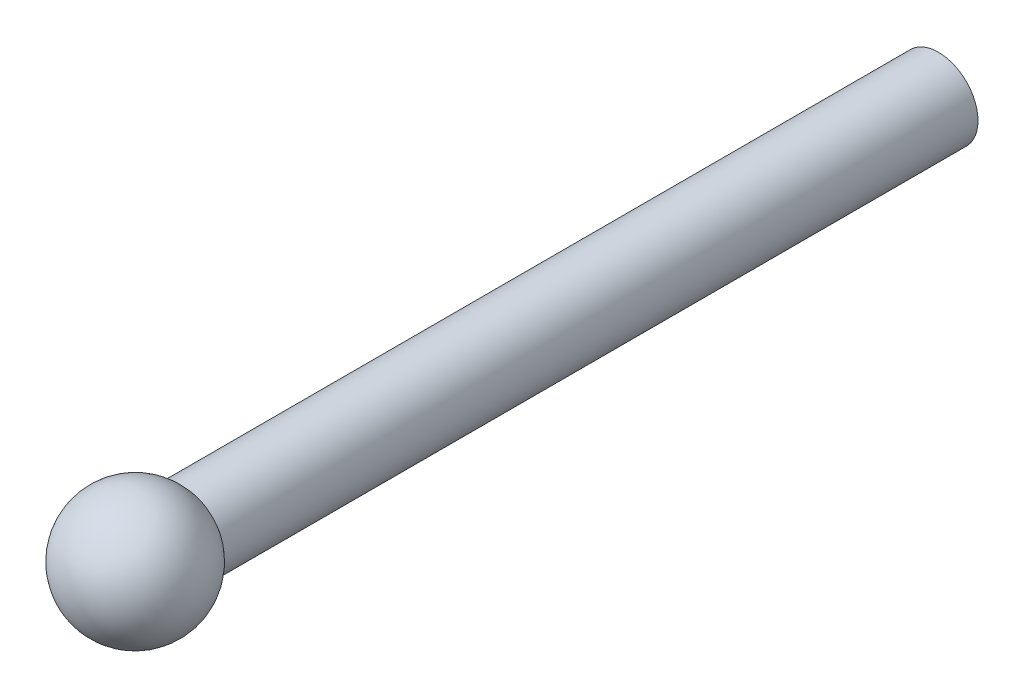
ISO-10303-21;
HEADER;
FILE_DESCRIPTION(('STEP AP214'),'2;1');
FILE_NAME('part.step','',(''),(''),'','','');
FILE_SCHEMA(('AUTOMOTIVE_DESIGN { 1 0 10303 214 1 1 1 1 }'));
ENDSEC;
DATA;
#1=APPLICATION_CONTEXT('core data for automotive mechanical design processes');
#2=APPLICATION_PROTOCOL_DEFINITION('international standard','automotive_design',2000,#1);
#3=PRODUCT_CONTEXT('',#1,'mechanical');
#4=PRODUCT('Part','Part','',(#3));
#5=PRODUCT_RELATED_PRODUCT_CATEGORY('part','',(#4));
#6=PRODUCT_DEFINITION_FORMATION('','',#4);
#7=PRODUCT_DEFINITION_CONTEXT('part definition',#1,'design');
#8=PRODUCT_DEFINITION('design','',#6,#7);
#9=PRODUCT_DEFINITION_SHAPE('','',#8);
#10=(LENGTH_UNIT() NAMED_UNIT(*) SI_UNIT(.MILLI.,.METRE.));
#11=(NAMED_UNIT(*) PLANE_ANGLE_UNIT() SI_UNIT($,.RADIAN.));
#12=(NAMED_UNIT(*) SI_UNIT($,.STERADIAN.) SOLID_ANGLE_UNIT());
#13=UNCERTAINTY_MEASURE_WITH_UNIT(LENGTH_MEASURE(1.E-05),#10,'distance_accuracy_value','');
#14=(GEOMETRIC_REPRESENTATION_CONTEXT(3) GLOBAL_UNCERTAINTY_ASSIGNED_CONTEXT((#13)) GLOBAL_UNIT_ASSIGNED_CONTEXT((#10,
#11,#12)) REPRESENTATION_CONTEXT('',''));
#15=CARTESIAN_POINT('',(0.,0.,0.));
#16=DIRECTION('',(0.,0.,1.));
#17=DIRECTION('',(1.,0.,0.));
#18=AXIS2_PLACEMENT_3D('',#15,#16,#17);
#19=CARTESIAN_POINT('',(0.,0.,0.5));
#20=DIRECTION('',(0.,-1.,0.));
#21=DIRECTION('',(-1.,0.,0.));
#22=AXIS2_PLACEMENT_3D('',#19,#20,#21);
#23=SPHERICAL_SURFACE('',#22,2.4);
#24=CARTESIAN_POINT('',(0.,0.,0.5));
#25=DIRECTION('',(0.,0.,1.));
#26=DIRECTION('',(1.,0.,0.));
#27=AXIS2_PLACEMENT_3D('',#24,#25,#26);
#28=SPHERICAL_SURFACE('',#27,2.4);
#29=CARTESIAN_POINT('',(0.,0.,-1.37349939951952));
#30=DIRECTION('',(0.,0.,1.));
#31=DIRECTION('',(1.,0.,0.));
#32=AXIS2_PLACEMENT_3D('',#29,#30,#31);
#33=CIRCLE('',#32,1.5);
#34=CARTESIAN_POINT('',(1.5,0.,-1.37349939951952));
#35=VERTEX_POINT('',#34);
#36=EDGE_CURVE('E36',#35,#35,#33,.F.);
#37=ORIENTED_EDGE('',*,*,#36,.F.);
#38=EDGE_LOOP('',(#37));
#39=FACE_BOUND('',#38,.T.);
#40=ADVANCED_FACE('F32',(#39),#28,.T.);
#41=CARTESIAN_POINT('',(0.,0.,-30.));
#42=DIRECTION('',(0.,0.,1.));
#43=DIRECTION('',(1.,0.,0.));
#44=AXIS2_PLACEMENT_3D('',#41,#42,#43);
#45=CYLINDRICAL_SURFACE('',#44,1.5);
#46=CARTESIAN_POINT('',(0.,0.,-30.));
#47=DIRECTION('',(0.,0.,1.));
#48=DIRECTION('',(1.,0.,0.));
#49=AXIS2_PLACEMENT_3D('',#46,#47,#48);
#50=CIRCLE('',#49,1.5);
#51=CARTESIAN_POINT('',(1.5,0.,-30.));
#52=VERTEX_POINT('',#51);
#53=EDGE_CURVE('E10',#52,#52,#50,.T.);
#54=ORIENTED_EDGE('',*,*,#53,.T.);
#55=EDGE_LOOP('',(#54));
#56=FACE_BOUND('',#55,.T.);
#57=ORIENTED_EDGE('',*,*,#36,.T.);
#58=EDGE_LOOP('',(#57));
#59=FACE_BOUND('',#58,.T.);
#60=ADVANCED_FACE('F34',(#56,#59),#45,.T.);
#61=CARTESIAN_POINT('',(0.,0.,-30.));
#62=DIRECTION('',(0.,0.,1.));
#63=DIRECTION('',(1.,0.,0.));
#64=AXIS2_PLACEMENT_3D('',#61,#62,#63);
#65=PLANE('',#64);
#66=ORIENTED_EDGE('',*,*,#53,.F.);
#67=EDGE_LOOP('',(#66));
#68=FACE_BOUND('',#67,.T.);
#69=ADVANCED_FACE('F51',(#68),#65,.F.);
#70=CLOSED_SHELL('',(#40,#60,#69));
#71=MANIFOLD_SOLID_BREP('B2',#70);
#72=ADVANCED_BREP_SHAPE_REPRESENTATION('',(#18,#71),#14);
#73=SHAPE_DEFINITION_REPRESENTATION(#9,#72);
ENDSEC;
END-ISO-10303-21;
